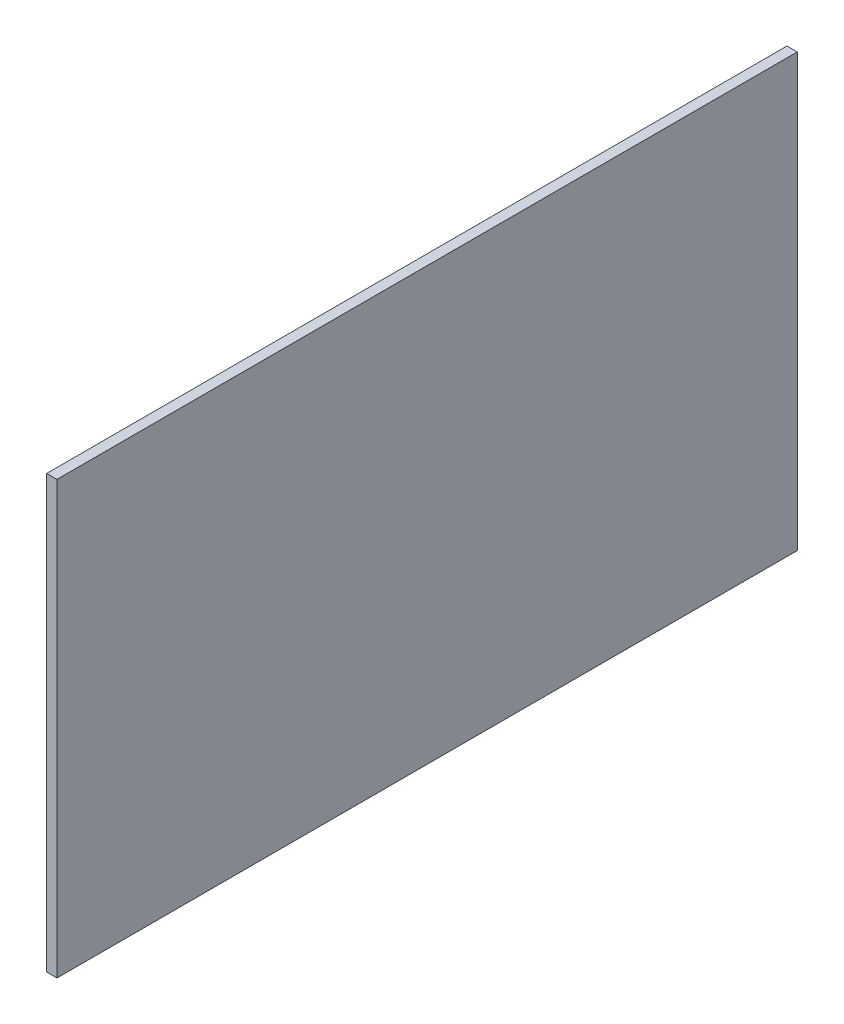
ISO-10303-21;
HEADER;
FILE_DESCRIPTION(('STEP AP214'),'2;1');
FILE_NAME('part.step','',(''),(''),'','','');
FILE_SCHEMA(('AUTOMOTIVE_DESIGN { 1 0 10303 214 1 1 1 1 }'));
ENDSEC;
DATA;
#1=APPLICATION_CONTEXT('core data for automotive mechanical design processes');
#2=APPLICATION_PROTOCOL_DEFINITION('international standard','automotive_design',2000,#1);
#3=PRODUCT_CONTEXT('',#1,'mechanical');
#4=PRODUCT('Part','Part','',(#3));
#5=PRODUCT_RELATED_PRODUCT_CATEGORY('part','',(#4));
#6=PRODUCT_DEFINITION_FORMATION('','',#4);
#7=PRODUCT_DEFINITION_CONTEXT('part definition',#1,'design');
#8=PRODUCT_DEFINITION('design','',#6,#7);
#9=PRODUCT_DEFINITION_SHAPE('','',#8);
#10=(LENGTH_UNIT() NAMED_UNIT(*) SI_UNIT(.MILLI.,.METRE.));
#11=(NAMED_UNIT(*) PLANE_ANGLE_UNIT() SI_UNIT($,.RADIAN.));
#12=(NAMED_UNIT(*) SI_UNIT($,.STERADIAN.) SOLID_ANGLE_UNIT());
#13=UNCERTAINTY_MEASURE_WITH_UNIT(LENGTH_MEASURE(1.E-05),#10,'distance_accuracy_value','');
#14=(GEOMETRIC_REPRESENTATION_CONTEXT(3) GLOBAL_UNCERTAINTY_ASSIGNED_CONTEXT((#13)) GLOBAL_UNIT_ASSIGNED_CONTEXT((#10,
#11,#12)) REPRESENTATION_CONTEXT('',''));
#15=CARTESIAN_POINT('',(0.,0.,0.));
#16=DIRECTION('',(0.,0.,1.));
#17=DIRECTION('',(1.,0.,0.));
#18=AXIS2_PLACEMENT_3D('',#15,#16,#17);
#19=CARTESIAN_POINT('',(1.5875,33.3375,-57.15));
#20=DIRECTION('',(0.,0.,1.));
#21=DIRECTION('',(1.,0.,0.));
#22=AXIS2_PLACEMENT_3D('',#19,#20,#21);
#23=PLANE('',#22);
#24=DIRECTION('',(0.,1.,0.));
#25=VECTOR('',#24,1.);
#26=CARTESIAN_POINT('',(0.,33.3375,-57.15));
#27=LINE('',#26,#25);
#28=CARTESIAN_POINT('',(0.,-33.3375,-57.15));
#29=VERTEX_POINT('',#28);
#30=CARTESIAN_POINT('',(0.,33.3375,-57.15));
#31=VERTEX_POINT('',#30);
#32=EDGE_CURVE('E107',#29,#31,#27,.T.);
#33=ORIENTED_EDGE('',*,*,#32,.T.);
#34=DIRECTION('',(-1.,0.,0.));
#35=VECTOR('',#34,1.);
#36=CARTESIAN_POINT('',(1.5875,33.3375,-57.15));
#37=LINE('',#36,#35);
#38=CARTESIAN_POINT('',(1.5875,33.3375,-57.15));
#39=VERTEX_POINT('',#38);
#40=EDGE_CURVE('E11',#39,#31,#37,.T.);
#41=ORIENTED_EDGE('',*,*,#40,.F.);
#42=DIRECTION('',(0.,1.,0.));
#43=VECTOR('',#42,1.);
#44=CARTESIAN_POINT('',(1.5875,33.3375,-57.15));
#45=LINE('',#44,#43);
#46=CARTESIAN_POINT('',(1.5875,-33.3375,-57.15));
#47=VERTEX_POINT('',#46);
#48=EDGE_CURVE('E91',#47,#39,#45,.T.);
#49=ORIENTED_EDGE('',*,*,#48,.F.);
#50=DIRECTION('',(-1.,0.,0.));
#51=VECTOR('',#50,1.);
#52=CARTESIAN_POINT('',(1.5875,-33.3375,-57.15));
#53=LINE('',#52,#51);
#54=EDGE_CURVE('E103',#47,#29,#53,.T.);
#55=ORIENTED_EDGE('',*,*,#54,.T.);
#56=EDGE_LOOP('',(#33,#41,#49,#55));
#57=FACE_BOUND('',#56,.T.);
#58=ADVANCED_FACE('F39',(#57),#23,.F.);
#59=CARTESIAN_POINT('',(1.5875,33.3375,57.15));
#60=DIRECTION('',(0.,-1.,0.));
#61=DIRECTION('',(0.,0.,-1.));
#62=AXIS2_PLACEMENT_3D('',#59,#60,#61);
#63=PLANE('',#62);
#64=DIRECTION('',(0.,0.,1.));
#65=VECTOR('',#64,1.);
#66=CARTESIAN_POINT('',(0.,33.3375,57.15));
#67=LINE('',#66,#65);
#68=CARTESIAN_POINT('',(0.,33.3375,57.15));
#69=VERTEX_POINT('',#68);
#70=EDGE_CURVE('E96',#31,#69,#67,.T.);
#71=ORIENTED_EDGE('',*,*,#70,.T.);
#72=DIRECTION('',(-1.,0.,0.));
#73=VECTOR('',#72,1.);
#74=CARTESIAN_POINT('',(1.5875,33.3375,57.15));
#75=LINE('',#74,#73);
#76=CARTESIAN_POINT('',(1.5875,33.3375,57.15));
#77=VERTEX_POINT('',#76);
#78=EDGE_CURVE('E48',#77,#69,#75,.T.);
#79=ORIENTED_EDGE('',*,*,#78,.F.);
#80=DIRECTION('',(0.,0.,1.));
#81=VECTOR('',#80,1.);
#82=CARTESIAN_POINT('',(1.5875,33.3375,57.15));
#83=LINE('',#82,#81);
#84=EDGE_CURVE('E86',#39,#77,#83,.T.);
#85=ORIENTED_EDGE('',*,*,#84,.F.);
#86=ORIENTED_EDGE('',*,*,#40,.T.);
#87=EDGE_LOOP('',(#71,#79,#85,#86));
#88=FACE_BOUND('',#87,.T.);
#89=ADVANCED_FACE('F95',(#88),#63,.F.);
#90=CARTESIAN_POINT('',(1.5875,33.3375,57.15));
#91=DIRECTION('',(0.,0.,-1.));
#92=DIRECTION('',(0.,1.,0.));
#93=AXIS2_PLACEMENT_3D('',#90,#91,#92);
#94=PLANE('',#93);
#95=DIRECTION('',(0.,-1.,0.));
#96=VECTOR('',#95,1.);
#97=CARTESIAN_POINT('',(0.,33.3375,57.15));
#98=LINE('',#97,#96);
#99=CARTESIAN_POINT('',(0.,-33.3375,57.15));
#100=VERTEX_POINT('',#99);
#101=EDGE_CURVE('E73',#69,#100,#98,.T.);
#102=ORIENTED_EDGE('',*,*,#101,.T.);
#103=DIRECTION('',(-1.,0.,0.));
#104=VECTOR('',#103,1.);
#105=CARTESIAN_POINT('',(1.5875,-33.3375,57.15));
#106=LINE('',#105,#104);
#107=CARTESIAN_POINT('',(1.5875,-33.3375,57.15));
#108=VERTEX_POINT('',#107);
#109=EDGE_CURVE('E98',#108,#100,#106,.T.);
#110=ORIENTED_EDGE('',*,*,#109,.F.);
#111=DIRECTION('',(0.,-1.,0.));
#112=VECTOR('',#111,1.);
#113=CARTESIAN_POINT('',(1.5875,33.3375,57.15));
#114=LINE('',#113,#112);
#115=EDGE_CURVE('E89',#77,#108,#114,.T.);
#116=ORIENTED_EDGE('',*,*,#115,.F.);
#117=ORIENTED_EDGE('',*,*,#78,.T.);
#118=EDGE_LOOP('',(#102,#110,#116,#117));
#119=FACE_BOUND('',#118,.T.);
#120=ADVANCED_FACE('F99',(#119),#94,.F.);
#121=CARTESIAN_POINT('',(1.5875,-33.3375,57.15));
#122=DIRECTION('',(0.,1.,0.));
#123=DIRECTION('',(0.,0.,1.));
#124=AXIS2_PLACEMENT_3D('',#121,#122,#123);
#125=PLANE('',#124);
#126=DIRECTION('',(0.,0.,-1.));
#127=VECTOR('',#126,1.);
#128=CARTESIAN_POINT('',(0.,-33.3375,57.15));
#129=LINE('',#128,#127);
#130=EDGE_CURVE('E79',#100,#29,#129,.T.);
#131=ORIENTED_EDGE('',*,*,#130,.T.);
#132=ORIENTED_EDGE('',*,*,#54,.F.);
#133=DIRECTION('',(0.,0.,-1.));
#134=VECTOR('',#133,1.);
#135=CARTESIAN_POINT('',(1.5875,-33.3375,57.15));
#136=LINE('',#135,#134);
#137=EDGE_CURVE('E56',#108,#47,#136,.T.);
#138=ORIENTED_EDGE('',*,*,#137,.F.);
#139=ORIENTED_EDGE('',*,*,#109,.T.);
#140=EDGE_LOOP('',(#131,#132,#138,#139));
#141=FACE_BOUND('',#140,.T.);
#142=ADVANCED_FACE('F120',(#141),#125,.F.);
#143=CARTESIAN_POINT('',(1.5875,0.,0.));
#144=DIRECTION('',(1.,0.,0.));
#145=DIRECTION('',(0.,0.,-1.));
#146=AXIS2_PLACEMENT_3D('',#143,#144,#145);
#147=PLANE('',#146);
#148=ORIENTED_EDGE('',*,*,#48,.T.);
#149=ORIENTED_EDGE('',*,*,#84,.T.);
#150=ORIENTED_EDGE('',*,*,#115,.T.);
#151=ORIENTED_EDGE('',*,*,#137,.T.);
#152=EDGE_LOOP('',(#148,#149,#150,#151));
#153=FACE_BOUND('',#152,.T.);
#154=ADVANCED_FACE('F87',(#153),#147,.T.);
#155=CARTESIAN_POINT('',(0.,0.,0.));
#156=DIRECTION('',(1.,0.,0.));
#157=DIRECTION('',(0.,0.,-1.));
#158=AXIS2_PLACEMENT_3D('',#155,#156,#157);
#159=PLANE('',#158);
#160=ORIENTED_EDGE('',*,*,#32,.F.);
#161=ORIENTED_EDGE('',*,*,#130,.F.);
#162=ORIENTED_EDGE('',*,*,#101,.F.);
#163=ORIENTED_EDGE('',*,*,#70,.F.);
#164=EDGE_LOOP('',(#160,#161,#162,#163));
#165=FACE_BOUND('',#164,.T.);
#166=ADVANCED_FACE('F123',(#165),#159,.F.);
#167=CLOSED_SHELL('',(#58,#89,#120,#142,#154,#166));
#168=MANIFOLD_SOLID_BREP('B2',#167);
#169=ADVANCED_BREP_SHAPE_REPRESENTATION('',(#18,#168),#14);
#170=SHAPE_DEFINITION_REPRESENTATION(#9,#169);
ENDSEC;
END-ISO-10303-21;
